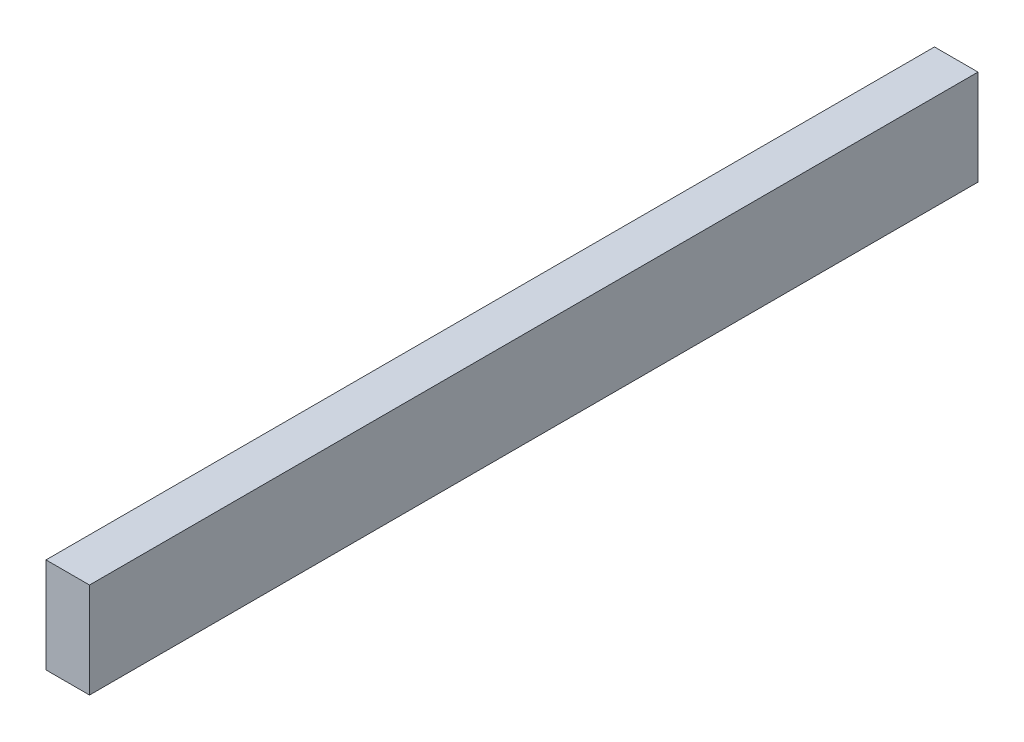
ISO-10303-21;
HEADER;
FILE_DESCRIPTION(('STEP AP214'),'2;1');
FILE_NAME('part.step','',(''),(''),'','','');
FILE_SCHEMA(('AUTOMOTIVE_DESIGN { 1 0 10303 214 1 1 1 1 }'));
ENDSEC;
DATA;
#1=APPLICATION_CONTEXT('core data for automotive mechanical design processes');
#2=APPLICATION_PROTOCOL_DEFINITION('international standard','automotive_design',2000,#1);
#3=PRODUCT_CONTEXT('',#1,'mechanical');
#4=PRODUCT('Part','Part','',(#3));
#5=PRODUCT_RELATED_PRODUCT_CATEGORY('part','',(#4));
#6=PRODUCT_DEFINITION_FORMATION('','',#4);
#7=PRODUCT_DEFINITION_CONTEXT('part definition',#1,'design');
#8=PRODUCT_DEFINITION('design','',#6,#7);
#9=PRODUCT_DEFINITION_SHAPE('','',#8);
#10=(LENGTH_UNIT() NAMED_UNIT(*) SI_UNIT(.MILLI.,.METRE.));
#11=(NAMED_UNIT(*) PLANE_ANGLE_UNIT() SI_UNIT($,.RADIAN.));
#12=(NAMED_UNIT(*) SI_UNIT($,.STERADIAN.) SOLID_ANGLE_UNIT());
#13=UNCERTAINTY_MEASURE_WITH_UNIT(LENGTH_MEASURE(1.E-05),#10,'distance_accuracy_value','');
#14=(GEOMETRIC_REPRESENTATION_CONTEXT(3) GLOBAL_UNCERTAINTY_ASSIGNED_CONTEXT((#13)) GLOBAL_UNIT_ASSIGNED_CONTEXT((#10,
#11,#12)) REPRESENTATION_CONTEXT('',''));
#15=CARTESIAN_POINT('',(0.,0.,0.));
#16=DIRECTION('',(0.,0.,1.));
#17=DIRECTION('',(1.,0.,0.));
#18=AXIS2_PLACEMENT_3D('',#15,#16,#17);
#19=CARTESIAN_POINT('',(3.429,-7.51,70.));
#20=DIRECTION('',(-1.,0.,0.));
#21=DIRECTION('',(0.,0.,1.));
#22=AXIS2_PLACEMENT_3D('',#19,#20,#21);
#23=PLANE('',#22);
#24=DIRECTION('',(0.,1.,0.));
#25=VECTOR('',#24,1.);
#26=CARTESIAN_POINT('',(3.429,-7.51,-70.));
#27=LINE('',#26,#25);
#28=CARTESIAN_POINT('',(3.429,-7.51,-70.));
#29=VERTEX_POINT('',#28);
#30=CARTESIAN_POINT('',(3.429,7.51,-70.));
#31=VERTEX_POINT('',#30);
#32=EDGE_CURVE('E98',#29,#31,#27,.T.);
#33=ORIENTED_EDGE('',*,*,#32,.T.);
#34=DIRECTION('',(0.,0.,-1.));
#35=VECTOR('',#34,1.);
#36=CARTESIAN_POINT('',(3.429,7.51,70.));
#37=LINE('',#36,#35);
#38=CARTESIAN_POINT('',(3.429,7.51,70.));
#39=VERTEX_POINT('',#38);
#40=EDGE_CURVE('E11',#39,#31,#37,.T.);
#41=ORIENTED_EDGE('',*,*,#40,.F.);
#42=DIRECTION('',(0.,1.,0.));
#43=VECTOR('',#42,1.);
#44=CARTESIAN_POINT('',(3.429,-7.51,70.));
#45=LINE('',#44,#43);
#46=CARTESIAN_POINT('',(3.429,-7.51,70.));
#47=VERTEX_POINT('',#46);
#48=EDGE_CURVE('E86',#47,#39,#45,.T.);
#49=ORIENTED_EDGE('',*,*,#48,.F.);
#50=DIRECTION('',(0.,0.,-1.));
#51=VECTOR('',#50,1.);
#52=CARTESIAN_POINT('',(3.429,-7.51,70.));
#53=LINE('',#52,#51);
#54=EDGE_CURVE('E94',#47,#29,#53,.T.);
#55=ORIENTED_EDGE('',*,*,#54,.T.);
#56=EDGE_LOOP('',(#33,#41,#49,#55));
#57=FACE_BOUND('',#56,.T.);
#58=ADVANCED_FACE('F35',(#57),#23,.F.);
#59=CARTESIAN_POINT('',(-3.429,7.51,70.));
#60=DIRECTION('',(0.,-1.,0.));
#61=DIRECTION('',(0.,0.,-1.));
#62=AXIS2_PLACEMENT_3D('',#59,#60,#61);
#63=PLANE('',#62);
#64=DIRECTION('',(-1.,0.,0.));
#65=VECTOR('',#64,1.);
#66=CARTESIAN_POINT('',(-3.429,7.51,-70.));
#67=LINE('',#66,#65);
#68=CARTESIAN_POINT('',(-3.429,7.51,-70.));
#69=VERTEX_POINT('',#68);
#70=EDGE_CURVE('E90',#31,#69,#67,.T.);
#71=ORIENTED_EDGE('',*,*,#70,.T.);
#72=DIRECTION('',(0.,0.,-1.));
#73=VECTOR('',#72,1.);
#74=CARTESIAN_POINT('',(-3.429,7.51,70.));
#75=LINE('',#74,#73);
#76=CARTESIAN_POINT('',(-3.429,7.51,70.));
#77=VERTEX_POINT('',#76);
#78=EDGE_CURVE('E43',#77,#69,#75,.T.);
#79=ORIENTED_EDGE('',*,*,#78,.F.);
#80=DIRECTION('',(-1.,0.,0.));
#81=VECTOR('',#80,1.);
#82=CARTESIAN_POINT('',(-3.429,7.51,70.));
#83=LINE('',#82,#81);
#84=EDGE_CURVE('E81',#39,#77,#83,.T.);
#85=ORIENTED_EDGE('',*,*,#84,.F.);
#86=ORIENTED_EDGE('',*,*,#40,.T.);
#87=EDGE_LOOP('',(#71,#79,#85,#86));
#88=FACE_BOUND('',#87,.T.);
#89=ADVANCED_FACE('F89',(#88),#63,.F.);
#90=CARTESIAN_POINT('',(-3.429,-7.51,70.));
#91=DIRECTION('',(1.,0.,0.));
#92=DIRECTION('',(0.,0.,-1.));
#93=AXIS2_PLACEMENT_3D('',#90,#91,#92);
#94=PLANE('',#93);
#95=DIRECTION('',(0.,-1.,0.));
#96=VECTOR('',#95,1.);
#97=CARTESIAN_POINT('',(-3.429,-7.51,-70.));
#98=LINE('',#97,#96);
#99=CARTESIAN_POINT('',(-3.429,-7.51,-70.));
#100=VERTEX_POINT('',#99);
#101=EDGE_CURVE('E68',#69,#100,#98,.T.);
#102=ORIENTED_EDGE('',*,*,#101,.T.);
#103=DIRECTION('',(0.,0.,-1.));
#104=VECTOR('',#103,1.);
#105=CARTESIAN_POINT('',(-3.429,-7.51,70.));
#106=LINE('',#105,#104);
#107=CARTESIAN_POINT('',(-3.429,-7.51,70.));
#108=VERTEX_POINT('',#107);
#109=EDGE_CURVE('E91',#108,#100,#106,.T.);
#110=ORIENTED_EDGE('',*,*,#109,.F.);
#111=DIRECTION('',(0.,-1.,0.));
#112=VECTOR('',#111,1.);
#113=CARTESIAN_POINT('',(-3.429,-7.51,70.));
#114=LINE('',#113,#112);
#115=EDGE_CURVE('E84',#77,#108,#114,.T.);
#116=ORIENTED_EDGE('',*,*,#115,.F.);
#117=ORIENTED_EDGE('',*,*,#78,.T.);
#118=EDGE_LOOP('',(#102,#110,#116,#117));
#119=FACE_BOUND('',#118,.T.);
#120=ADVANCED_FACE('F92',(#119),#94,.F.);
#121=CARTESIAN_POINT('',(-3.429,-7.51,70.));
#122=DIRECTION('',(0.,1.,0.));
#123=DIRECTION('',(0.,0.,1.));
#124=AXIS2_PLACEMENT_3D('',#121,#122,#123);
#125=PLANE('',#124);
#126=DIRECTION('',(1.,0.,0.));
#127=VECTOR('',#126,1.);
#128=CARTESIAN_POINT('',(-3.429,-7.51,-70.));
#129=LINE('',#128,#127);
#130=EDGE_CURVE('E74',#100,#29,#129,.T.);
#131=ORIENTED_EDGE('',*,*,#130,.T.);
#132=ORIENTED_EDGE('',*,*,#54,.F.);
#133=DIRECTION('',(1.,0.,0.));
#134=VECTOR('',#133,1.);
#135=CARTESIAN_POINT('',(-3.429,-7.51,70.));
#136=LINE('',#135,#134);
#137=EDGE_CURVE('E51',#108,#47,#136,.T.);
#138=ORIENTED_EDGE('',*,*,#137,.F.);
#139=ORIENTED_EDGE('',*,*,#109,.T.);
#140=EDGE_LOOP('',(#131,#132,#138,#139));
#141=FACE_BOUND('',#140,.T.);
#142=ADVANCED_FACE('F105',(#141),#125,.F.);
#143=CARTESIAN_POINT('',(0.,0.,70.));
#144=DIRECTION('',(0.,0.,-1.));
#145=DIRECTION('',(-1.,0.,0.));
#146=AXIS2_PLACEMENT_3D('',#143,#144,#145);
#147=PLANE('',#146);
#148=ORIENTED_EDGE('',*,*,#48,.T.);
#149=ORIENTED_EDGE('',*,*,#84,.T.);
#150=ORIENTED_EDGE('',*,*,#115,.T.);
#151=ORIENTED_EDGE('',*,*,#137,.T.);
#152=EDGE_LOOP('',(#148,#149,#150,#151));
#153=FACE_BOUND('',#152,.T.);
#154=ADVANCED_FACE('F82',(#153),#147,.F.);
#155=CARTESIAN_POINT('',(0.,0.,-70.));
#156=DIRECTION('',(0.,0.,-1.));
#157=DIRECTION('',(-1.,0.,0.));
#158=AXIS2_PLACEMENT_3D('',#155,#156,#157);
#159=PLANE('',#158);
#160=ORIENTED_EDGE('',*,*,#32,.F.);
#161=ORIENTED_EDGE('',*,*,#130,.F.);
#162=ORIENTED_EDGE('',*,*,#101,.F.);
#163=ORIENTED_EDGE('',*,*,#70,.F.);
#164=EDGE_LOOP('',(#160,#161,#162,#163));
#165=FACE_BOUND('',#164,.T.);
#166=ADVANCED_FACE('F108',(#165),#159,.T.);
#167=CLOSED_SHELL('',(#58,#89,#120,#142,#154,#166));
#168=MANIFOLD_SOLID_BREP('B2',#167);
#169=ADVANCED_BREP_SHAPE_REPRESENTATION('',(#18,#168),#14);
#170=SHAPE_DEFINITION_REPRESENTATION(#9,#169);
ENDSEC;
END-ISO-10303-21;
